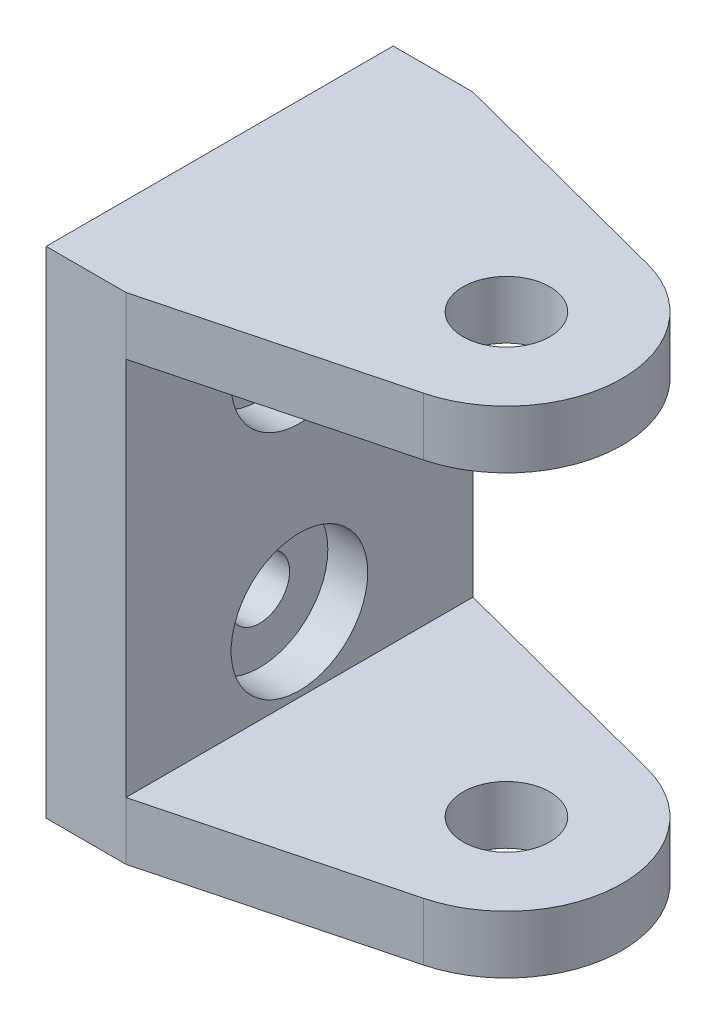
ISO-10303-21;
HEADER;
FILE_DESCRIPTION(('STEP AP214'),'2;1');
FILE_NAME('part.step','',(''),(''),'','','');
FILE_SCHEMA(('AUTOMOTIVE_DESIGN { 1 0 10303 214 1 1 1 1 }'));
ENDSEC;
DATA;
#1=APPLICATION_CONTEXT('core data for automotive mechanical design processes');
#2=APPLICATION_PROTOCOL_DEFINITION('international standard','automotive_design',2000,#1);
#3=PRODUCT_CONTEXT('',#1,'mechanical');
#4=PRODUCT('Part','Part','',(#3));
#5=PRODUCT_RELATED_PRODUCT_CATEGORY('part','',(#4));
#6=PRODUCT_DEFINITION_FORMATION('','',#4);
#7=PRODUCT_DEFINITION_CONTEXT('part definition',#1,'design');
#8=PRODUCT_DEFINITION('design','',#6,#7);
#9=PRODUCT_DEFINITION_SHAPE('','',#8);
#10=(LENGTH_UNIT() NAMED_UNIT(*) SI_UNIT(.MILLI.,.METRE.));
#11=(NAMED_UNIT(*) PLANE_ANGLE_UNIT() SI_UNIT($,.RADIAN.));
#12=(NAMED_UNIT(*) SI_UNIT($,.STERADIAN.) SOLID_ANGLE_UNIT());
#13=UNCERTAINTY_MEASURE_WITH_UNIT(LENGTH_MEASURE(1.E-05),#10,'distance_accuracy_value','');
#14=(GEOMETRIC_REPRESENTATION_CONTEXT(3) GLOBAL_UNCERTAINTY_ASSIGNED_CONTEXT((#13)) GLOBAL_UNIT_ASSIGNED_CONTEXT((#10,
#11,#12)) REPRESENTATION_CONTEXT('',''));
#15=CARTESIAN_POINT('',(0.,0.,0.));
#16=DIRECTION('',(0.,0.,1.));
#17=DIRECTION('',(1.,0.,0.));
#18=AXIS2_PLACEMENT_3D('',#15,#16,#17);
#19=CARTESIAN_POINT('',(24.3908646789021,54.37886,27.7209531601615));
#20=DIRECTION('',(-1.,0.,0.));
#21=DIRECTION('',(0.,0.,1.));
#22=AXIS2_PLACEMENT_3D('',#19,#20,#21);
#23=PLANE('',#22);
#24=CARTESIAN_POINT('',(24.3908646789021,39.88943,46.7709531601615));
#25=DIRECTION('',(1.,0.,0.));
#26=DIRECTION('',(0.,0.,-1.));
#27=AXIS2_PLACEMENT_3D('',#24,#25,#26);
#28=CIRCLE('',#27,7.5);
#29=CARTESIAN_POINT('',(24.3908646789021,39.88943,39.2709531601615));
#30=VERTEX_POINT('',#29);
#31=EDGE_CURVE('E229',#30,#30,#28,.T.);
#32=ORIENTED_EDGE('',*,*,#31,.F.);
#33=EDGE_LOOP('',(#32));
#34=FACE_BOUND('',#33,.T.);
#35=CARTESIAN_POINT('',(24.3908646789021,14.48943,46.7709531601615));
#36=DIRECTION('',(1.,0.,0.));
#37=DIRECTION('',(0.,0.,-1.));
#38=AXIS2_PLACEMENT_3D('',#35,#36,#37);
#39=CIRCLE('',#38,7.5);
#40=CARTESIAN_POINT('',(24.3908646789021,14.48943,39.2709531601615));
#41=VERTEX_POINT('',#40);
#42=EDGE_CURVE('E214',#41,#41,#39,.T.);
#43=ORIENTED_EDGE('',*,*,#42,.F.);
#44=EDGE_LOOP('',(#43));
#45=FACE_BOUND('',#44,.T.);
#46=DIRECTION('',(0.,0.,1.));
#47=VECTOR('',#46,1.);
#48=CARTESIAN_POINT('',(24.3908646789021,6.35,27.7209531601615));
#49=LINE('',#48,#47);
#50=CARTESIAN_POINT('',(24.3908646789021,6.35,27.7209531601615));
#51=VERTEX_POINT('',#50);
#52=CARTESIAN_POINT('',(24.3908646789021,6.35,65.8209531601615));
#53=VERTEX_POINT('',#52);
#54=EDGE_CURVE('E73',#51,#53,#49,.T.);
#55=ORIENTED_EDGE('',*,*,#54,.F.);
#56=DIRECTION('',(0.,-1.,0.));
#57=VECTOR('',#56,1.);
#58=CARTESIAN_POINT('',(24.3908646789021,54.37886,27.7209531601615));
#59=LINE('',#58,#57);
#60=CARTESIAN_POINT('',(24.3908646789021,48.02886,27.7209531601615));
#61=VERTEX_POINT('',#60);
#62=EDGE_CURVE('E189',#61,#51,#59,.T.);
#63=ORIENTED_EDGE('',*,*,#62,.F.);
#64=DIRECTION('',(0.,0.,1.));
#65=VECTOR('',#64,1.);
#66=CARTESIAN_POINT('',(24.3908646789021,48.02886,27.7209531601615));
#67=LINE('',#66,#65);
#68=CARTESIAN_POINT('',(24.3908646789021,48.02886,65.8209531601615));
#69=VERTEX_POINT('',#68);
#70=EDGE_CURVE('E548',#61,#69,#67,.T.);
#71=ORIENTED_EDGE('',*,*,#70,.T.);
#72=DIRECTION('',(0.,-1.,0.));
#73=VECTOR('',#72,1.);
#74=CARTESIAN_POINT('',(24.3908646789021,54.37886,65.8209531601615));
#75=LINE('',#74,#73);
#76=EDGE_CURVE('E199',#69,#53,#75,.T.);
#77=ORIENTED_EDGE('',*,*,#76,.T.);
#78=EDGE_LOOP('',(#55,#63,#71,#77));
#79=FACE_BOUND('',#78,.T.);
#80=ADVANCED_FACE('F49',(#34,#45,#79),#23,.F.);
#81=CARTESIAN_POINT('',(15.6308646789021,54.37886,27.7209531601615));
#82=DIRECTION('',(0.,0.,1.));
#83=DIRECTION('',(1.,0.,0.));
#84=AXIS2_PLACEMENT_3D('',#81,#82,#83);
#85=PLANE('',#84);
#86=DIRECTION('',(-1.,0.,0.));
#87=VECTOR('',#86,1.);
#88=CARTESIAN_POINT('',(15.6308646789021,0.,27.7209531601615));
#89=LINE('',#88,#87);
#90=CARTESIAN_POINT('',(24.3908646789021,0.,27.7209531601615));
#91=VERTEX_POINT('',#90);
#92=CARTESIAN_POINT('',(15.6308646789021,0.,27.7209531601615));
#93=VERTEX_POINT('',#92);
#94=EDGE_CURVE('E190',#91,#93,#89,.T.);
#95=ORIENTED_EDGE('',*,*,#94,.T.);
#96=DIRECTION('',(0.,-1.,0.));
#97=VECTOR('',#96,1.);
#98=CARTESIAN_POINT('',(15.6308646789021,54.37886,27.7209531601615));
#99=LINE('',#98,#97);
#100=CARTESIAN_POINT('',(15.6308646789021,54.37886,27.7209531601615));
#101=VERTEX_POINT('',#100);
#102=EDGE_CURVE('E12',#101,#93,#99,.T.);
#103=ORIENTED_EDGE('',*,*,#102,.F.);
#104=DIRECTION('',(-1.,0.,0.));
#105=VECTOR('',#104,1.);
#106=CARTESIAN_POINT('',(15.6308646789021,54.37886,27.7209531601615));
#107=LINE('',#106,#105);
#108=CARTESIAN_POINT('',(24.3908646789021,54.37886,27.7209531601615));
#109=VERTEX_POINT('',#108);
#110=EDGE_CURVE('E180',#109,#101,#107,.T.);
#111=ORIENTED_EDGE('',*,*,#110,.F.);
#112=EDGE_CURVE('E196',#109,#61,#59,.T.);
#113=ORIENTED_EDGE('',*,*,#112,.T.);
#114=ORIENTED_EDGE('',*,*,#62,.T.);
#115=DIRECTION('',(0.,-1.,0.));
#116=VECTOR('',#115,1.);
#117=CARTESIAN_POINT('',(24.3908646789021,6.35,27.7209531601615));
#118=LINE('',#117,#116);
#119=EDGE_CURVE('E152',#51,#91,#118,.T.);
#120=ORIENTED_EDGE('',*,*,#119,.T.);
#121=EDGE_LOOP('',(#95,#103,#111,#113,#114,#120));
#122=FACE_BOUND('',#121,.T.);
#123=ADVANCED_FACE('F51',(#122),#85,.F.);
#124=CARTESIAN_POINT('',(15.6308646789021,54.37886,65.8209531601615));
#125=DIRECTION('',(1.,0.,0.));
#126=DIRECTION('',(0.,0.,-1.));
#127=AXIS2_PLACEMENT_3D('',#124,#125,#126);
#128=PLANE('',#127);
#129=CARTESIAN_POINT('',(15.6308646789021,14.48943,46.7709531601615));
#130=DIRECTION('',(1.,0.,0.));
#131=DIRECTION('',(0.,0.,-1.));
#132=AXIS2_PLACEMENT_3D('',#129,#130,#131);
#133=CIRCLE('',#132,3.3);
#134=CARTESIAN_POINT('',(15.6308646789021,14.48943,43.4709531601615));
#135=VERTEX_POINT('',#134);
#136=EDGE_CURVE('E53',#135,#135,#133,.T.);
#137=ORIENTED_EDGE('',*,*,#136,.T.);
#138=EDGE_LOOP('',(#137));
#139=FACE_BOUND('',#138,.T.);
#140=CARTESIAN_POINT('',(15.6308646789021,39.88943,46.7709531601615));
#141=DIRECTION('',(1.,0.,0.));
#142=DIRECTION('',(0.,0.,-1.));
#143=AXIS2_PLACEMENT_3D('',#140,#141,#142);
#144=CIRCLE('',#143,3.3);
#145=CARTESIAN_POINT('',(15.6308646789021,39.88943,43.4709531601615));
#146=VERTEX_POINT('',#145);
#147=EDGE_CURVE('E177',#146,#146,#144,.T.);
#148=ORIENTED_EDGE('',*,*,#147,.T.);
#149=EDGE_LOOP('',(#148));
#150=FACE_BOUND('',#149,.T.);
#151=DIRECTION('',(0.,0.,1.));
#152=VECTOR('',#151,1.);
#153=CARTESIAN_POINT('',(15.6308646789021,0.,65.8209531601615));
#154=LINE('',#153,#152);
#155=CARTESIAN_POINT('',(15.6308646789021,0.,65.8209531601615));
#156=VERTEX_POINT('',#155);
#157=EDGE_CURVE('E193',#93,#156,#154,.T.);
#158=ORIENTED_EDGE('',*,*,#157,.T.);
#159=DIRECTION('',(0.,-1.,0.));
#160=VECTOR('',#159,1.);
#161=CARTESIAN_POINT('',(15.6308646789021,54.37886,65.8209531601615));
#162=LINE('',#161,#160);
#163=CARTESIAN_POINT('',(15.6308646789021,54.37886,65.8209531601615));
#164=VERTEX_POINT('',#163);
#165=EDGE_CURVE('E58',#164,#156,#162,.T.);
#166=ORIENTED_EDGE('',*,*,#165,.F.);
#167=DIRECTION('',(0.,0.,1.));
#168=VECTOR('',#167,1.);
#169=CARTESIAN_POINT('',(15.6308646789021,54.37886,65.8209531601615));
#170=LINE('',#169,#168);
#171=EDGE_CURVE('E183',#101,#164,#170,.T.);
#172=ORIENTED_EDGE('',*,*,#171,.F.);
#173=ORIENTED_EDGE('',*,*,#102,.T.);
#174=EDGE_LOOP('',(#158,#166,#172,#173));
#175=FACE_BOUND('',#174,.T.);
#176=ADVANCED_FACE('F244',(#139,#150,#175),#128,.F.);
#177=CARTESIAN_POINT('',(24.3908646789021,54.37886,65.8209531601615));
#178=DIRECTION('',(0.,0.,-1.));
#179=DIRECTION('',(-1.,0.,0.));
#180=AXIS2_PLACEMENT_3D('',#177,#178,#179);
#181=PLANE('',#180);
#182=DIRECTION('',(1.,0.,0.));
#183=VECTOR('',#182,1.);
#184=CARTESIAN_POINT('',(24.3908646789021,0.,65.8209531601615));
#185=LINE('',#184,#183);
#186=CARTESIAN_POINT('',(24.3908646789021,0.,65.8209531601615));
#187=VERTEX_POINT('',#186);
#188=EDGE_CURVE('E184',#156,#187,#185,.T.);
#189=ORIENTED_EDGE('',*,*,#188,.T.);
#190=DIRECTION('',(0.,-1.,0.));
#191=VECTOR('',#190,1.);
#192=CARTESIAN_POINT('',(24.3908646789021,6.35,65.8209531601615));
#193=LINE('',#192,#191);
#194=EDGE_CURVE('E66',#53,#187,#193,.T.);
#195=ORIENTED_EDGE('',*,*,#194,.F.);
#196=ORIENTED_EDGE('',*,*,#76,.F.);
#197=CARTESIAN_POINT('',(24.3908646789021,54.37886,65.8209531601615));
#198=VERTEX_POINT('',#197);
#199=EDGE_CURVE('E200',#198,#69,#75,.T.);
#200=ORIENTED_EDGE('',*,*,#199,.F.);
#201=DIRECTION('',(1.,0.,0.));
#202=VECTOR('',#201,1.);
#203=CARTESIAN_POINT('',(24.3908646789021,54.37886,65.8209531601615));
#204=LINE('',#203,#202);
#205=EDGE_CURVE('E186',#164,#198,#204,.T.);
#206=ORIENTED_EDGE('',*,*,#205,.F.);
#207=ORIENTED_EDGE('',*,*,#165,.T.);
#208=EDGE_LOOP('',(#189,#195,#196,#200,#206,#207));
#209=FACE_BOUND('',#208,.T.);
#210=ADVANCED_FACE('F275',(#209),#181,.F.);
#211=CARTESIAN_POINT('',(0.,54.37886,0.));
#212=DIRECTION('',(0.,-1.,0.));
#213=DIRECTION('',(0.,0.,-1.));
#214=AXIS2_PLACEMENT_3D('',#211,#212,#213);
#215=PLANE('',#214);
#216=ORIENTED_EDGE('',*,*,#110,.T.);
#217=ORIENTED_EDGE('',*,*,#171,.T.);
#218=ORIENTED_EDGE('',*,*,#205,.T.);
#219=DIRECTION('',(0.967654349973361,0.,-0.252279723675192));
#220=VECTOR('',#219,1.);
#221=CARTESIAN_POINT('',(24.3908646789021,54.37886,65.8209531601615));
#222=LINE('',#221,#220);
#223=CARTESIAN_POINT('',(50.3228243334399,54.37886,59.0601634048288));
#224=VERTEX_POINT('',#223);
#225=EDGE_CURVE('E493',#198,#224,#222,.T.);
#226=ORIENTED_EDGE('',*,*,#225,.T.);
#227=CARTESIAN_POINT('',(47.1188718427649,54.37886,46.7709531601671));
#228=DIRECTION('',(0.,1.,0.));
#229=DIRECTION('',(0.,0.,1.));
#230=AXIS2_PLACEMENT_3D('',#227,#228,#229);
#231=CIRCLE('',#230,12.7);
#232=CARTESIAN_POINT('',(50.3228243334448,54.37886,34.4817429155068));
#233=VERTEX_POINT('',#232);
#234=EDGE_CURVE('E500',#224,#233,#231,.T.);
#235=ORIENTED_EDGE('',*,*,#234,.T.);
#236=DIRECTION('',(-0.967654349973259,0.,-0.252279723675584));
#237=VECTOR('',#236,1.);
#238=CARTESIAN_POINT('',(24.3908646789021,54.37886,27.7209531601615));
#239=LINE('',#238,#237);
#240=EDGE_CURVE('E543',#233,#109,#239,.T.);
#241=ORIENTED_EDGE('',*,*,#240,.T.);
#242=EDGE_LOOP('',(#216,#217,#218,#226,#235,#241));
#243=FACE_BOUND('',#242,.T.);
#244=CARTESIAN_POINT('',(47.1188718427649,54.37886,46.7709531601671));
#245=DIRECTION('',(0.,1.,0.));
#246=DIRECTION('',(0.,0.,1.));
#247=AXIS2_PLACEMENT_3D('',#244,#245,#246);
#248=CIRCLE('',#247,4.7625);
#249=CARTESIAN_POINT('',(47.1188718427649,54.37886,51.5334531601671));
#250=VERTEX_POINT('',#249);
#251=EDGE_CURVE('E530',#250,#250,#248,.T.);
#252=ORIENTED_EDGE('',*,*,#251,.F.);
#253=EDGE_LOOP('',(#252));
#254=FACE_BOUND('',#253,.T.);
#255=ADVANCED_FACE('F277',(#243,#254),#215,.F.);
#256=CARTESIAN_POINT('',(0.,0.,0.));
#257=DIRECTION('',(0.,-1.,0.));
#258=DIRECTION('',(0.,0.,-1.));
#259=AXIS2_PLACEMENT_3D('',#256,#257,#258);
#260=PLANE('',#259);
#261=ORIENTED_EDGE('',*,*,#94,.F.);
#262=DIRECTION('',(-0.967654349973259,0.,-0.252279723675584));
#263=VECTOR('',#262,1.);
#264=CARTESIAN_POINT('',(24.3908646789021,0.,27.7209531601615));
#265=LINE('',#264,#263);
#266=CARTESIAN_POINT('',(50.3228243334448,0.,34.4817429155068));
#267=VERTEX_POINT('',#266);
#268=EDGE_CURVE('E513',#267,#91,#265,.T.);
#269=ORIENTED_EDGE('',*,*,#268,.F.);
#270=CARTESIAN_POINT('',(47.1188718427649,0.,46.7709531601671));
#271=DIRECTION('',(0.,1.,0.));
#272=DIRECTION('',(0.,0.,1.));
#273=AXIS2_PLACEMENT_3D('',#270,#271,#272);
#274=CIRCLE('',#273,12.7);
#275=CARTESIAN_POINT('',(50.3228243334399,0.,59.0601634048288));
#276=VERTEX_POINT('',#275);
#277=EDGE_CURVE('E147',#276,#267,#274,.T.);
#278=ORIENTED_EDGE('',*,*,#277,.F.);
#279=DIRECTION('',(0.967654349973361,0.,-0.252279723675192));
#280=VECTOR('',#279,1.);
#281=CARTESIAN_POINT('',(24.3908646789021,0.,65.8209531601615));
#282=LINE('',#281,#280);
#283=EDGE_CURVE('E161',#187,#276,#282,.T.);
#284=ORIENTED_EDGE('',*,*,#283,.F.);
#285=ORIENTED_EDGE('',*,*,#188,.F.);
#286=ORIENTED_EDGE('',*,*,#157,.F.);
#287=EDGE_LOOP('',(#261,#269,#278,#284,#285,#286));
#288=FACE_BOUND('',#287,.T.);
#289=CARTESIAN_POINT('',(47.1188718427649,0.,46.7709531601671));
#290=DIRECTION('',(0.,1.,0.));
#291=DIRECTION('',(0.,0.,1.));
#292=AXIS2_PLACEMENT_3D('',#289,#290,#291);
#293=CIRCLE('',#292,4.7625);
#294=CARTESIAN_POINT('',(47.1188718427649,0.,51.5334531601671));
#295=VERTEX_POINT('',#294);
#296=EDGE_CURVE('E517',#295,#295,#293,.T.);
#297=ORIENTED_EDGE('',*,*,#296,.T.);
#298=EDGE_LOOP('',(#297));
#299=FACE_BOUND('',#298,.T.);
#300=ADVANCED_FACE('F273',(#288,#299),#260,.T.);
#301=CARTESIAN_POINT('',(24.3908646789021,39.88943,46.7709531601615));
#302=DIRECTION('',(1.,0.,0.));
#303=DIRECTION('',(0.,0.,-1.));
#304=AXIS2_PLACEMENT_3D('',#301,#302,#303);
#305=CYLINDRICAL_SURFACE('',#304,3.3);
#306=CARTESIAN_POINT('',(20.0108646789021,39.88943,46.7709531601615));
#307=DIRECTION('',(1.,0.,0.));
#308=DIRECTION('',(0.,0.,-1.));
#309=AXIS2_PLACEMENT_3D('',#306,#307,#308);
#310=CIRCLE('',#309,3.3);
#311=CARTESIAN_POINT('',(20.0108646789021,39.88943,43.4709531601615));
#312=VERTEX_POINT('',#311);
#313=EDGE_CURVE('E172',#312,#312,#310,.T.);
#314=ORIENTED_EDGE('',*,*,#313,.T.);
#315=EDGE_LOOP('',(#314));
#316=FACE_BOUND('',#315,.T.);
#317=ORIENTED_EDGE('',*,*,#147,.F.);
#318=EDGE_LOOP('',(#317));
#319=FACE_BOUND('',#318,.T.);
#320=ADVANCED_FACE('F297',(#316,#319),#305,.F.);
#321=CARTESIAN_POINT('',(20.0108646789021,43.18943,46.7709531601615));
#322=DIRECTION('',(-1.,0.,0.));
#323=DIRECTION('',(0.,0.,1.));
#324=AXIS2_PLACEMENT_3D('',#321,#322,#323);
#325=PLANE('',#324);
#326=ORIENTED_EDGE('',*,*,#313,.F.);
#327=EDGE_LOOP('',(#326));
#328=FACE_BOUND('',#327,.T.);
#329=CARTESIAN_POINT('',(20.0108646789021,39.88943,46.7709531601615));
#330=DIRECTION('',(1.,0.,0.));
#331=DIRECTION('',(0.,0.,-1.));
#332=AXIS2_PLACEMENT_3D('',#329,#330,#331);
#333=CIRCLE('',#332,7.5);
#334=CARTESIAN_POINT('',(20.0108646789021,39.88943,39.2709531601615));
#335=VERTEX_POINT('',#334);
#336=EDGE_CURVE('E178',#335,#335,#333,.T.);
#337=ORIENTED_EDGE('',*,*,#336,.T.);
#338=EDGE_LOOP('',(#337));
#339=FACE_BOUND('',#338,.T.);
#340=ADVANCED_FACE('F260',(#328,#339),#325,.F.);
#341=CARTESIAN_POINT('',(24.3908646789021,39.88943,46.7709531601615));
#342=DIRECTION('',(1.,0.,0.));
#343=DIRECTION('',(0.,0.,-1.));
#344=AXIS2_PLACEMENT_3D('',#341,#342,#343);
#345=CYLINDRICAL_SURFACE('',#344,7.5);
#346=ORIENTED_EDGE('',*,*,#336,.F.);
#347=EDGE_LOOP('',(#346));
#348=FACE_BOUND('',#347,.T.);
#349=ORIENTED_EDGE('',*,*,#31,.T.);
#350=EDGE_LOOP('',(#349));
#351=FACE_BOUND('',#350,.T.);
#352=ADVANCED_FACE('F250',(#348,#351),#345,.F.);
#353=CARTESIAN_POINT('',(24.3908646789021,14.48943,46.7709531601615));
#354=DIRECTION('',(1.,0.,0.));
#355=DIRECTION('',(0.,0.,-1.));
#356=AXIS2_PLACEMENT_3D('',#353,#354,#355);
#357=CYLINDRICAL_SURFACE('',#356,3.3);
#358=CARTESIAN_POINT('',(20.0108646789021,14.48943,46.7709531601615));
#359=DIRECTION('',(1.,0.,0.));
#360=DIRECTION('',(0.,0.,-1.));
#361=AXIS2_PLACEMENT_3D('',#358,#359,#360);
#362=CIRCLE('',#361,3.3);
#363=CARTESIAN_POINT('',(20.0108646789021,14.48943,43.4709531601615));
#364=VERTEX_POINT('',#363);
#365=EDGE_CURVE('E225',#364,#364,#362,.T.);
#366=ORIENTED_EDGE('',*,*,#365,.T.);
#367=EDGE_LOOP('',(#366));
#368=FACE_BOUND('',#367,.T.);
#369=ORIENTED_EDGE('',*,*,#136,.F.);
#370=EDGE_LOOP('',(#369));
#371=FACE_BOUND('',#370,.T.);
#372=ADVANCED_FACE('F247',(#368,#371),#357,.F.);
#373=CARTESIAN_POINT('',(20.0108646789021,17.78943,46.7709531601615));
#374=DIRECTION('',(-1.,0.,0.));
#375=DIRECTION('',(0.,0.,1.));
#376=AXIS2_PLACEMENT_3D('',#373,#374,#375);
#377=PLANE('',#376);
#378=ORIENTED_EDGE('',*,*,#365,.F.);
#379=EDGE_LOOP('',(#378));
#380=FACE_BOUND('',#379,.T.);
#381=CARTESIAN_POINT('',(20.0108646789021,14.48943,46.7709531601615));
#382=DIRECTION('',(1.,0.,0.));
#383=DIRECTION('',(0.,0.,-1.));
#384=AXIS2_PLACEMENT_3D('',#381,#382,#383);
#385=CIRCLE('',#384,7.5);
#386=CARTESIAN_POINT('',(20.0108646789021,14.48943,39.2709531601615));
#387=VERTEX_POINT('',#386);
#388=EDGE_CURVE('E220',#387,#387,#385,.T.);
#389=ORIENTED_EDGE('',*,*,#388,.T.);
#390=EDGE_LOOP('',(#389));
#391=FACE_BOUND('',#390,.T.);
#392=ADVANCED_FACE('F249',(#380,#391),#377,.F.);
#393=CARTESIAN_POINT('',(24.3908646789021,14.48943,46.7709531601615));
#394=DIRECTION('',(1.,0.,0.));
#395=DIRECTION('',(0.,0.,-1.));
#396=AXIS2_PLACEMENT_3D('',#393,#394,#395);
#397=CYLINDRICAL_SURFACE('',#396,7.5);
#398=ORIENTED_EDGE('',*,*,#388,.F.);
#399=EDGE_LOOP('',(#398));
#400=FACE_BOUND('',#399,.T.);
#401=ORIENTED_EDGE('',*,*,#42,.T.);
#402=EDGE_LOOP('',(#401));
#403=FACE_BOUND('',#402,.T.);
#404=ADVANCED_FACE('F257',(#400,#403),#397,.F.);
#405=CARTESIAN_POINT('',(24.3908646789021,48.02886,65.8209531601615));
#406=DIRECTION('',(0.252279723675192,0.,0.967654349973361));
#407=DIRECTION('',(0.967654349973362,0.,-0.252279723675192));
#408=AXIS2_PLACEMENT_3D('',#405,#406,#407);
#409=PLANE('',#408);
#410=ORIENTED_EDGE('',*,*,#225,.F.);
#411=ORIENTED_EDGE('',*,*,#199,.T.);
#412=DIRECTION('',(0.967654349973361,0.,-0.252279723675192));
#413=VECTOR('',#412,1.);
#414=CARTESIAN_POINT('',(24.3908646789021,48.02886,65.8209531601615));
#415=LINE('',#414,#413);
#416=CARTESIAN_POINT('',(50.3228243334399,48.02886,59.0601634048288));
#417=VERTEX_POINT('',#416);
#418=EDGE_CURVE('E539',#69,#417,#415,.T.);
#419=ORIENTED_EDGE('',*,*,#418,.T.);
#420=DIRECTION('',(0.,1.,0.));
#421=VECTOR('',#420,1.);
#422=CARTESIAN_POINT('',(50.3228243334399,48.02886,59.0601634048288));
#423=LINE('',#422,#421);
#424=EDGE_CURVE('E222',#417,#224,#423,.T.);
#425=ORIENTED_EDGE('',*,*,#424,.T.);
#426=EDGE_LOOP('',(#410,#411,#419,#425));
#427=FACE_BOUND('',#426,.T.);
#428=ADVANCED_FACE('F328',(#427),#409,.T.);
#429=CARTESIAN_POINT('',(24.3908646789021,48.02886,27.7209531601615));
#430=DIRECTION('',(0.252279723675584,0.,-0.967654349973259));
#431=DIRECTION('',(-0.967654349973259,0.,-0.252279723675584));
#432=AXIS2_PLACEMENT_3D('',#429,#430,#431);
#433=PLANE('',#432);
#434=ORIENTED_EDGE('',*,*,#240,.F.);
#435=DIRECTION('',(0.,1.,0.));
#436=VECTOR('',#435,1.);
#437=CARTESIAN_POINT('',(50.3228243334448,48.02886,34.4817429155068));
#438=LINE('',#437,#436);
#439=CARTESIAN_POINT('',(50.3228243334448,48.02886,34.4817429155068));
#440=VERTEX_POINT('',#439);
#441=EDGE_CURVE('E221',#440,#233,#438,.T.);
#442=ORIENTED_EDGE('',*,*,#441,.F.);
#443=DIRECTION('',(-0.967654349973259,0.,-0.252279723675584));
#444=VECTOR('',#443,1.);
#445=CARTESIAN_POINT('',(24.3908646789021,48.02886,27.7209531601615));
#446=LINE('',#445,#444);
#447=EDGE_CURVE('E546',#440,#61,#446,.T.);
#448=ORIENTED_EDGE('',*,*,#447,.T.);
#449=ORIENTED_EDGE('',*,*,#112,.F.);
#450=EDGE_LOOP('',(#434,#442,#448,#449));
#451=FACE_BOUND('',#450,.T.);
#452=ADVANCED_FACE('F335',(#451),#433,.T.);
#453=CARTESIAN_POINT('',(47.1188718427649,48.02886,46.7709531601671));
#454=DIRECTION('',(0.,1.,0.));
#455=DIRECTION('',(0.,0.,1.));
#456=AXIS2_PLACEMENT_3D('',#453,#454,#455);
#457=CYLINDRICAL_SURFACE('',#456,12.7);
#458=ORIENTED_EDGE('',*,*,#234,.F.);
#459=ORIENTED_EDGE('',*,*,#424,.F.);
#460=CARTESIAN_POINT('',(47.1188718427649,48.02886,46.7709531601671));
#461=DIRECTION('',(0.,1.,0.));
#462=DIRECTION('',(0.,0.,1.));
#463=AXIS2_PLACEMENT_3D('',#460,#461,#462);
#464=CIRCLE('',#463,12.7);
#465=EDGE_CURVE('E542',#417,#440,#464,.T.);
#466=ORIENTED_EDGE('',*,*,#465,.T.);
#467=ORIENTED_EDGE('',*,*,#441,.T.);
#468=EDGE_LOOP('',(#458,#459,#466,#467));
#469=FACE_BOUND('',#468,.T.);
#470=ADVANCED_FACE('F339',(#469),#457,.T.);
#471=CARTESIAN_POINT('',(47.1188718427649,48.02886,46.7709531601671));
#472=DIRECTION('',(0.,1.,0.));
#473=DIRECTION('',(0.,0.,1.));
#474=AXIS2_PLACEMENT_3D('',#471,#472,#473);
#475=PLANE('',#474);
#476=CARTESIAN_POINT('',(47.1188718427649,48.02886,46.7709531601671));
#477=DIRECTION('',(0.,1.,0.));
#478=DIRECTION('',(0.,0.,1.));
#479=AXIS2_PLACEMENT_3D('',#476,#477,#478);
#480=CIRCLE('',#479,4.7625);
#481=CARTESIAN_POINT('',(47.1188718427649,48.02886,51.5334531601671));
#482=VERTEX_POINT('',#481);
#483=EDGE_CURVE('E501',#482,#482,#480,.T.);
#484=ORIENTED_EDGE('',*,*,#483,.T.);
#485=EDGE_LOOP('',(#484));
#486=FACE_BOUND('',#485,.T.);
#487=ORIENTED_EDGE('',*,*,#418,.F.);
#488=ORIENTED_EDGE('',*,*,#70,.F.);
#489=ORIENTED_EDGE('',*,*,#447,.F.);
#490=ORIENTED_EDGE('',*,*,#465,.F.);
#491=EDGE_LOOP('',(#487,#488,#489,#490));
#492=FACE_BOUND('',#491,.T.);
#493=ADVANCED_FACE('F349',(#486,#492),#475,.F.);
#494=CARTESIAN_POINT('',(47.1188718427649,48.02886,46.7709531601671));
#495=DIRECTION('',(0.,1.,0.));
#496=DIRECTION('',(0.,0.,1.));
#497=AXIS2_PLACEMENT_3D('',#494,#495,#496);
#498=CYLINDRICAL_SURFACE('',#497,4.7625);
#499=ORIENTED_EDGE('',*,*,#483,.F.);
#500=EDGE_LOOP('',(#499));
#501=FACE_BOUND('',#500,.T.);
#502=ORIENTED_EDGE('',*,*,#251,.T.);
#503=EDGE_LOOP('',(#502));
#504=FACE_BOUND('',#503,.T.);
#505=ADVANCED_FACE('F357',(#501,#504),#498,.F.);
#506=CARTESIAN_POINT('',(47.1188718427649,6.35,46.7709531601671));
#507=DIRECTION('',(0.,-1.,0.));
#508=DIRECTION('',(0.,0.,1.));
#509=AXIS2_PLACEMENT_3D('',#506,#507,#508);
#510=PLANE('',#509);
#511=DIRECTION('',(0.967654349973361,0.,-0.252279723675192));
#512=VECTOR('',#511,1.);
#513=CARTESIAN_POINT('',(24.3908646789021,6.35,65.8209531601615));
#514=LINE('',#513,#512);
#515=CARTESIAN_POINT('',(50.3228243334399,6.35,59.0601634048288));
#516=VERTEX_POINT('',#515);
#517=EDGE_CURVE('E138',#53,#516,#514,.T.);
#518=ORIENTED_EDGE('',*,*,#517,.T.);
#519=CARTESIAN_POINT('',(47.1188718427649,6.35,46.7709531601671));
#520=DIRECTION('',(0.,1.,0.));
#521=DIRECTION('',(0.,0.,1.));
#522=AXIS2_PLACEMENT_3D('',#519,#520,#521);
#523=CIRCLE('',#522,12.7);
#524=CARTESIAN_POINT('',(50.3228243334448,6.35,34.4817429155068));
#525=VERTEX_POINT('',#524);
#526=EDGE_CURVE('E130',#516,#525,#523,.T.);
#527=ORIENTED_EDGE('',*,*,#526,.T.);
#528=DIRECTION('',(-0.967654349973259,0.,-0.252279723675584));
#529=VECTOR('',#528,1.);
#530=CARTESIAN_POINT('',(24.3908646789021,6.35,27.7209531601615));
#531=LINE('',#530,#529);
#532=EDGE_CURVE('E135',#525,#51,#531,.T.);
#533=ORIENTED_EDGE('',*,*,#532,.T.);
#534=ORIENTED_EDGE('',*,*,#54,.T.);
#535=EDGE_LOOP('',(#518,#527,#533,#534));
#536=FACE_BOUND('',#535,.T.);
#537=CARTESIAN_POINT('',(47.1188718427649,6.35,46.7709531601671));
#538=DIRECTION('',(0.,1.,0.));
#539=DIRECTION('',(0.,0.,1.));
#540=AXIS2_PLACEMENT_3D('',#537,#538,#539);
#541=CIRCLE('',#540,4.7625);
#542=CARTESIAN_POINT('',(47.1188718427649,6.35,51.5334531601671));
#543=VERTEX_POINT('',#542);
#544=EDGE_CURVE('E514',#543,#543,#541,.T.);
#545=ORIENTED_EDGE('',*,*,#544,.F.);
#546=EDGE_LOOP('',(#545));
#547=FACE_BOUND('',#546,.T.);
#548=ADVANCED_FACE('F132',(#536,#547),#510,.F.);
#549=CARTESIAN_POINT('',(24.3908646789021,6.35,65.8209531601615));
#550=DIRECTION('',(-0.252279723675192,0.,-0.967654349973361));
#551=DIRECTION('',(-0.967654349973362,0.,0.252279723675192));
#552=AXIS2_PLACEMENT_3D('',#549,#550,#551);
#553=PLANE('',#552);
#554=ORIENTED_EDGE('',*,*,#283,.T.);
#555=DIRECTION('',(0.,-1.,0.));
#556=VECTOR('',#555,1.);
#557=CARTESIAN_POINT('',(50.3228243334399,6.35,59.0601634048288));
#558=LINE('',#557,#556);
#559=EDGE_CURVE('E151',#516,#276,#558,.T.);
#560=ORIENTED_EDGE('',*,*,#559,.F.);
#561=ORIENTED_EDGE('',*,*,#517,.F.);
#562=ORIENTED_EDGE('',*,*,#194,.T.);
#563=EDGE_LOOP('',(#554,#560,#561,#562));
#564=FACE_BOUND('',#563,.T.);
#565=ADVANCED_FACE('F370',(#564),#553,.F.);
#566=CARTESIAN_POINT('',(47.1188718427649,6.35,46.7709531601671));
#567=DIRECTION('',(0.,-1.,0.));
#568=DIRECTION('',(0.,0.,-1.));
#569=AXIS2_PLACEMENT_3D('',#566,#567,#568);
#570=CYLINDRICAL_SURFACE('',#569,12.7);
#571=ORIENTED_EDGE('',*,*,#277,.T.);
#572=DIRECTION('',(0.,-1.,0.));
#573=VECTOR('',#572,1.);
#574=CARTESIAN_POINT('',(50.3228243334448,6.35,34.4817429155068));
#575=LINE('',#574,#573);
#576=EDGE_CURVE('E145',#525,#267,#575,.T.);
#577=ORIENTED_EDGE('',*,*,#576,.F.);
#578=ORIENTED_EDGE('',*,*,#526,.F.);
#579=ORIENTED_EDGE('',*,*,#559,.T.);
#580=EDGE_LOOP('',(#571,#577,#578,#579));
#581=FACE_BOUND('',#580,.T.);
#582=ADVANCED_FACE('F146',(#581),#570,.T.);
#583=CARTESIAN_POINT('',(24.3908646789021,6.35,27.7209531601615));
#584=DIRECTION('',(-0.252279723675584,0.,0.967654349973259));
#585=DIRECTION('',(0.967654349973259,0.,0.252279723675584));
#586=AXIS2_PLACEMENT_3D('',#583,#584,#585);
#587=PLANE('',#586);
#588=ORIENTED_EDGE('',*,*,#268,.T.);
#589=ORIENTED_EDGE('',*,*,#119,.F.);
#590=ORIENTED_EDGE('',*,*,#532,.F.);
#591=ORIENTED_EDGE('',*,*,#576,.T.);
#592=EDGE_LOOP('',(#588,#589,#590,#591));
#593=FACE_BOUND('',#592,.T.);
#594=ADVANCED_FACE('F154',(#593),#587,.F.);
#595=CARTESIAN_POINT('',(47.1188718427649,6.35,46.7709531601671));
#596=DIRECTION('',(0.,-1.,0.));
#597=DIRECTION('',(0.,0.,-1.));
#598=AXIS2_PLACEMENT_3D('',#595,#596,#597);
#599=CYLINDRICAL_SURFACE('',#598,4.7625);
#600=ORIENTED_EDGE('',*,*,#544,.T.);
#601=EDGE_LOOP('',(#600));
#602=FACE_BOUND('',#601,.T.);
#603=ORIENTED_EDGE('',*,*,#296,.F.);
#604=EDGE_LOOP('',(#603));
#605=FACE_BOUND('',#604,.T.);
#606=ADVANCED_FACE('F393',(#602,#605),#599,.F.);
#607=CLOSED_SHELL('',(#80,#123,#176,#210,#255,#300,#320,#340,#352,#372,#392,#404,#428,#452,#470,
#493,#505,#548,#565,#582,#594,#606));
#608=MANIFOLD_SOLID_BREP('B2',#607);
#609=ADVANCED_BREP_SHAPE_REPRESENTATION('',(#18,#608),#14);
#610=SHAPE_DEFINITION_REPRESENTATION(#9,#609);
ENDSEC;
END-ISO-10303-21;
